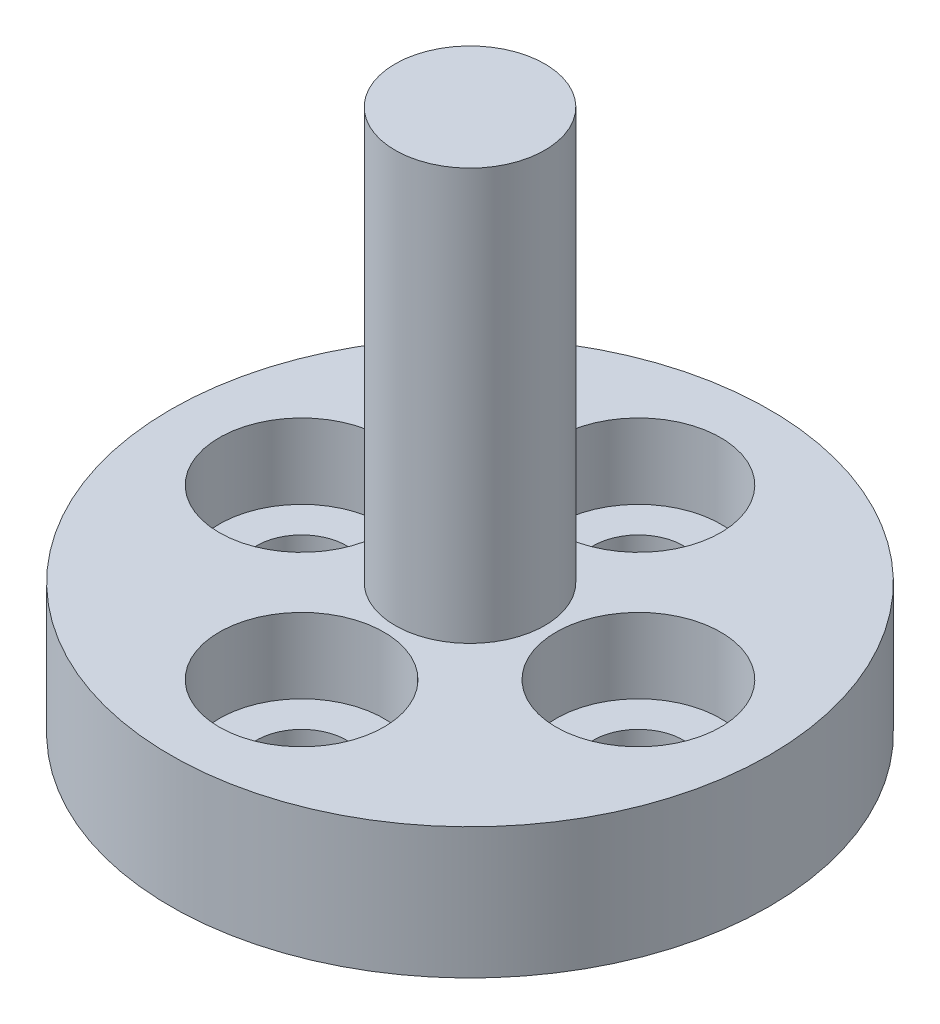
ISO-10303-21;
HEADER;
FILE_DESCRIPTION(('STEP AP214'),'2;1');
FILE_NAME('part.step','',(''),(''),'','','');
FILE_SCHEMA(('AUTOMOTIVE_DESIGN { 1 0 10303 214 1 1 1 1 }'));
ENDSEC;
DATA;
#1=APPLICATION_CONTEXT('core data for automotive mechanical design processes');
#2=APPLICATION_PROTOCOL_DEFINITION('international standard','automotive_design',2000,#1);
#3=PRODUCT_CONTEXT('',#1,'mechanical');
#4=PRODUCT('Part','Part','',(#3));
#5=PRODUCT_RELATED_PRODUCT_CATEGORY('part','',(#4));
#6=PRODUCT_DEFINITION_FORMATION('','',#4);
#7=PRODUCT_DEFINITION_CONTEXT('part definition',#1,'design');
#8=PRODUCT_DEFINITION('design','',#6,#7);
#9=PRODUCT_DEFINITION_SHAPE('','',#8);
#10=(LENGTH_UNIT() NAMED_UNIT(*) SI_UNIT(.MILLI.,.METRE.));
#11=(NAMED_UNIT(*) PLANE_ANGLE_UNIT() SI_UNIT($,.RADIAN.));
#12=(NAMED_UNIT(*) SI_UNIT($,.STERADIAN.) SOLID_ANGLE_UNIT());
#13=UNCERTAINTY_MEASURE_WITH_UNIT(LENGTH_MEASURE(1.E-05),#10,'distance_accuracy_value','');
#14=(GEOMETRIC_REPRESENTATION_CONTEXT(3) GLOBAL_UNCERTAINTY_ASSIGNED_CONTEXT((#13)) GLOBAL_UNIT_ASSIGNED_CONTEXT((#10,
#11,#12)) REPRESENTATION_CONTEXT('',''));
#15=CARTESIAN_POINT('',(0.,0.,0.));
#16=DIRECTION('',(0.,0.,1.));
#17=DIRECTION('',(1.,0.,0.));
#18=AXIS2_PLACEMENT_3D('',#15,#16,#17);
#19=CARTESIAN_POINT('',(0.,0.,0.));
#20=DIRECTION('',(0.,1.,0.));
#21=DIRECTION('',(-1.,0.,0.));
#22=AXIS2_PLACEMENT_3D('',#19,#20,#21);
#23=PLANE('',#22);
#24=CARTESIAN_POINT('',(-4.5,0.,0.));
#25=DIRECTION('',(0.,1.,0.));
#26=DIRECTION('',(0.,0.,1.));
#27=AXIS2_PLACEMENT_3D('',#24,#25,#26);
#28=CIRCLE('',#27,1.2);
#29=CARTESIAN_POINT('',(-4.5,0.,1.2));
#30=VERTEX_POINT('',#29);
#31=EDGE_CURVE('E108',#30,#30,#28,.T.);
#32=ORIENTED_EDGE('',*,*,#31,.T.);
#33=EDGE_LOOP('',(#32));
#34=FACE_BOUND('',#33,.T.);
#35=CARTESIAN_POINT('',(0.,0.,-4.5));
#36=DIRECTION('',(0.,1.,0.));
#37=DIRECTION('',(0.,0.,1.));
#38=AXIS2_PLACEMENT_3D('',#35,#36,#37);
#39=CIRCLE('',#38,1.2);
#40=CARTESIAN_POINT('',(0.,0.,-3.3));
#41=VERTEX_POINT('',#40);
#42=EDGE_CURVE('E92',#41,#41,#39,.T.);
#43=ORIENTED_EDGE('',*,*,#42,.T.);
#44=EDGE_LOOP('',(#43));
#45=FACE_BOUND('',#44,.T.);
#46=CARTESIAN_POINT('',(4.5,0.,0.));
#47=DIRECTION('',(0.,1.,0.));
#48=DIRECTION('',(0.,0.,1.));
#49=AXIS2_PLACEMENT_3D('',#46,#47,#48);
#50=CIRCLE('',#49,1.2);
#51=CARTESIAN_POINT('',(4.5,0.,1.2));
#52=VERTEX_POINT('',#51);
#53=EDGE_CURVE('E76',#52,#52,#50,.T.);
#54=ORIENTED_EDGE('',*,*,#53,.T.);
#55=EDGE_LOOP('',(#54));
#56=FACE_BOUND('',#55,.T.);
#57=CARTESIAN_POINT('',(0.,0.,4.5));
#58=DIRECTION('',(0.,1.,0.));
#59=DIRECTION('',(0.,0.,1.));
#60=AXIS2_PLACEMENT_3D('',#57,#58,#59);
#61=CIRCLE('',#60,1.2);
#62=CARTESIAN_POINT('',(0.,0.,5.7));
#63=VERTEX_POINT('',#62);
#64=EDGE_CURVE('E60',#63,#63,#61,.T.);
#65=ORIENTED_EDGE('',*,*,#64,.T.);
#66=EDGE_LOOP('',(#65));
#67=FACE_BOUND('',#66,.T.);
#68=CARTESIAN_POINT('',(0.,0.,0.));
#69=DIRECTION('',(0.,1.,0.));
#70=DIRECTION('',(-1.,0.,0.));
#71=AXIS2_PLACEMENT_3D('',#68,#69,#70);
#72=CIRCLE('',#71,8.);
#73=CARTESIAN_POINT('',(-8.,0.,0.));
#74=VERTEX_POINT('',#73);
#75=EDGE_CURVE('E10',#74,#74,#72,.T.);
#76=ORIENTED_EDGE('',*,*,#75,.F.);
#77=EDGE_LOOP('',(#76));
#78=FACE_BOUND('',#77,.T.);
#79=ADVANCED_FACE('F37',(#34,#45,#56,#67,#78),#23,.F.);
#80=CARTESIAN_POINT('',(0.,14.5,0.));
#81=DIRECTION('',(0.,1.,0.));
#82=DIRECTION('',(-1.,0.,0.));
#83=AXIS2_PLACEMENT_3D('',#80,#81,#82);
#84=CYLINDRICAL_SURFACE('',#83,8.);
#85=CARTESIAN_POINT('',(0.,3.5,0.));
#86=DIRECTION('',(0.,1.,0.));
#87=DIRECTION('',(-1.,0.,0.));
#88=AXIS2_PLACEMENT_3D('',#85,#86,#87);
#89=CIRCLE('',#88,8.);
#90=CARTESIAN_POINT('',(-8.,3.5,0.));
#91=VERTEX_POINT('',#90);
#92=EDGE_CURVE('E44',#91,#91,#89,.T.);
#93=ORIENTED_EDGE('',*,*,#92,.F.);
#94=EDGE_LOOP('',(#93));
#95=FACE_BOUND('',#94,.T.);
#96=ORIENTED_EDGE('',*,*,#75,.T.);
#97=EDGE_LOOP('',(#96));
#98=FACE_BOUND('',#97,.T.);
#99=ADVANCED_FACE('F131',(#95,#98),#84,.T.);
#100=CARTESIAN_POINT('',(8.,3.5,0.));
#101=DIRECTION('',(0.,-1.,0.));
#102=DIRECTION('',(1.,0.,0.));
#103=AXIS2_PLACEMENT_3D('',#100,#101,#102);
#104=PLANE('',#103);
#105=CARTESIAN_POINT('',(-4.5,3.5,0.));
#106=DIRECTION('',(0.,1.,0.));
#107=DIRECTION('',(0.,0.,1.));
#108=AXIS2_PLACEMENT_3D('',#105,#106,#107);
#109=CIRCLE('',#108,2.19999999999999);
#110=CARTESIAN_POINT('',(-4.5,3.5,2.19999999999999));
#111=VERTEX_POINT('',#110);
#112=EDGE_CURVE('E120',#111,#111,#109,.T.);
#113=ORIENTED_EDGE('',*,*,#112,.F.);
#114=EDGE_LOOP('',(#113));
#115=FACE_BOUND('',#114,.T.);
#116=CARTESIAN_POINT('',(0.,3.5,-4.5));
#117=DIRECTION('',(0.,1.,0.));
#118=DIRECTION('',(0.,0.,1.));
#119=AXIS2_PLACEMENT_3D('',#116,#117,#118);
#120=CIRCLE('',#119,2.19999999999999);
#121=CARTESIAN_POINT('',(0.,3.5,-2.30000000000001));
#122=VERTEX_POINT('',#121);
#123=EDGE_CURVE('E104',#122,#122,#120,.T.);
#124=ORIENTED_EDGE('',*,*,#123,.F.);
#125=EDGE_LOOP('',(#124));
#126=FACE_BOUND('',#125,.T.);
#127=CARTESIAN_POINT('',(4.5,3.5,0.));
#128=DIRECTION('',(0.,1.,0.));
#129=DIRECTION('',(0.,0.,1.));
#130=AXIS2_PLACEMENT_3D('',#127,#128,#129);
#131=CIRCLE('',#130,2.19999999999999);
#132=CARTESIAN_POINT('',(4.5,3.5,2.19999999999999));
#133=VERTEX_POINT('',#132);
#134=EDGE_CURVE('E88',#133,#133,#131,.T.);
#135=ORIENTED_EDGE('',*,*,#134,.F.);
#136=EDGE_LOOP('',(#135));
#137=FACE_BOUND('',#136,.T.);
#138=CARTESIAN_POINT('',(0.,3.5,4.5));
#139=DIRECTION('',(0.,1.,0.));
#140=DIRECTION('',(0.,0.,1.));
#141=AXIS2_PLACEMENT_3D('',#138,#139,#140);
#142=CIRCLE('',#141,2.19999999999999);
#143=CARTESIAN_POINT('',(0.,3.5,6.69999999999999));
#144=VERTEX_POINT('',#143);
#145=EDGE_CURVE('E72',#144,#144,#142,.T.);
#146=ORIENTED_EDGE('',*,*,#145,.F.);
#147=EDGE_LOOP('',(#146));
#148=FACE_BOUND('',#147,.T.);
#149=CARTESIAN_POINT('',(0.,3.5,0.));
#150=DIRECTION('',(0.,1.,0.));
#151=DIRECTION('',(-1.,0.,0.));
#152=AXIS2_PLACEMENT_3D('',#149,#150,#151);
#153=CIRCLE('',#152,2.);
#154=CARTESIAN_POINT('',(-2.,3.5,0.));
#155=VERTEX_POINT('',#154);
#156=EDGE_CURVE('E49',#155,#155,#153,.T.);
#157=ORIENTED_EDGE('',*,*,#156,.F.);
#158=EDGE_LOOP('',(#157));
#159=FACE_BOUND('',#158,.T.);
#160=ORIENTED_EDGE('',*,*,#92,.T.);
#161=EDGE_LOOP('',(#160));
#162=FACE_BOUND('',#161,.T.);
#163=ADVANCED_FACE('F127',(#115,#126,#137,#148,#159,#162),#104,.F.);
#164=CARTESIAN_POINT('',(0.,14.5,0.));
#165=DIRECTION('',(0.,1.,0.));
#166=DIRECTION('',(-1.,0.,0.));
#167=AXIS2_PLACEMENT_3D('',#164,#165,#166);
#168=CYLINDRICAL_SURFACE('',#167,2.);
#169=CARTESIAN_POINT('',(0.,14.5,0.));
#170=DIRECTION('',(0.,1.,0.));
#171=DIRECTION('',(-1.,0.,0.));
#172=AXIS2_PLACEMENT_3D('',#169,#170,#171);
#173=CIRCLE('',#172,2.);
#174=CARTESIAN_POINT('',(-2.,14.5,0.));
#175=VERTEX_POINT('',#174);
#176=EDGE_CURVE('E54',#175,#175,#173,.T.);
#177=ORIENTED_EDGE('',*,*,#176,.F.);
#178=EDGE_LOOP('',(#177));
#179=FACE_BOUND('',#178,.T.);
#180=ORIENTED_EDGE('',*,*,#156,.T.);
#181=EDGE_LOOP('',(#180));
#182=FACE_BOUND('',#181,.T.);
#183=ADVANCED_FACE('F130',(#179,#182),#168,.T.);
#184=CARTESIAN_POINT('',(2.,14.5,0.));
#185=DIRECTION('',(0.,-1.,0.));
#186=DIRECTION('',(1.,0.,0.));
#187=AXIS2_PLACEMENT_3D('',#184,#185,#186);
#188=PLANE('',#187);
#189=ORIENTED_EDGE('',*,*,#176,.T.);
#190=EDGE_LOOP('',(#189));
#191=FACE_BOUND('',#190,.T.);
#192=ADVANCED_FACE('F142',(#191),#188,.F.);
#193=CARTESIAN_POINT('',(0.,3.5,4.5));
#194=DIRECTION('',(0.,1.,0.));
#195=DIRECTION('',(0.,0.,1.));
#196=AXIS2_PLACEMENT_3D('',#193,#194,#195);
#197=CYLINDRICAL_SURFACE('',#196,1.2);
#198=ORIENTED_EDGE('',*,*,#64,.F.);
#199=EDGE_LOOP('',(#198));
#200=FACE_BOUND('',#199,.T.);
#201=CARTESIAN_POINT('',(0.,1.5,4.5));
#202=DIRECTION('',(0.,1.,0.));
#203=DIRECTION('',(0.,0.,1.));
#204=AXIS2_PLACEMENT_3D('',#201,#202,#203);
#205=CIRCLE('',#204,1.2);
#206=CARTESIAN_POINT('',(0.,1.5,5.7));
#207=VERTEX_POINT('',#206);
#208=EDGE_CURVE('E64',#207,#207,#205,.T.);
#209=ORIENTED_EDGE('',*,*,#208,.T.);
#210=EDGE_LOOP('',(#209));
#211=FACE_BOUND('',#210,.T.);
#212=ADVANCED_FACE('F148',(#200,#211),#197,.F.);
#213=CARTESIAN_POINT('',(1.2,1.5,4.5));
#214=DIRECTION('',(0.,-1.,0.));
#215=DIRECTION('',(0.,0.,-1.));
#216=AXIS2_PLACEMENT_3D('',#213,#214,#215);
#217=PLANE('',#216);
#218=ORIENTED_EDGE('',*,*,#208,.F.);
#219=EDGE_LOOP('',(#218));
#220=FACE_BOUND('',#219,.T.);
#221=CARTESIAN_POINT('',(0.,1.5,4.5));
#222=DIRECTION('',(0.,1.,0.));
#223=DIRECTION('',(0.,0.,1.));
#224=AXIS2_PLACEMENT_3D('',#221,#222,#223);
#225=CIRCLE('',#224,2.2);
#226=CARTESIAN_POINT('',(0.,1.5,6.7));
#227=VERTEX_POINT('',#226);
#228=EDGE_CURVE('E68',#227,#227,#225,.T.);
#229=ORIENTED_EDGE('',*,*,#228,.T.);
#230=EDGE_LOOP('',(#229));
#231=FACE_BOUND('',#230,.T.);
#232=ADVANCED_FACE('F169',(#220,#231),#217,.F.);
#233=CARTESIAN_POINT('',(0.,3.5,4.5));
#234=DIRECTION('',(0.,1.,0.));
#235=DIRECTION('',(0.,0.,1.));
#236=AXIS2_PLACEMENT_3D('',#233,#234,#235);
#237=CYLINDRICAL_SURFACE('',#236,2.19999999999999);
#238=ORIENTED_EDGE('',*,*,#228,.F.);
#239=EDGE_LOOP('',(#238));
#240=FACE_BOUND('',#239,.T.);
#241=ORIENTED_EDGE('',*,*,#145,.T.);
#242=EDGE_LOOP('',(#241));
#243=FACE_BOUND('',#242,.T.);
#244=ADVANCED_FACE('F175',(#240,#243),#237,.F.);
#245=CARTESIAN_POINT('',(4.5,3.5,0.));
#246=DIRECTION('',(0.,1.,0.));
#247=DIRECTION('',(0.,0.,1.));
#248=AXIS2_PLACEMENT_3D('',#245,#246,#247);
#249=CYLINDRICAL_SURFACE('',#248,1.2);
#250=ORIENTED_EDGE('',*,*,#53,.F.);
#251=EDGE_LOOP('',(#250));
#252=FACE_BOUND('',#251,.T.);
#253=CARTESIAN_POINT('',(4.5,1.5,0.));
#254=DIRECTION('',(0.,1.,0.));
#255=DIRECTION('',(0.,0.,1.));
#256=AXIS2_PLACEMENT_3D('',#253,#254,#255);
#257=CIRCLE('',#256,1.2);
#258=CARTESIAN_POINT('',(4.5,1.5,1.2));
#259=VERTEX_POINT('',#258);
#260=EDGE_CURVE('E80',#259,#259,#257,.T.);
#261=ORIENTED_EDGE('',*,*,#260,.T.);
#262=EDGE_LOOP('',(#261));
#263=FACE_BOUND('',#262,.T.);
#264=ADVANCED_FACE('F181',(#252,#263),#249,.F.);
#265=CARTESIAN_POINT('',(5.7,1.5,0.));
#266=DIRECTION('',(0.,-1.,0.));
#267=DIRECTION('',(0.,0.,-1.));
#268=AXIS2_PLACEMENT_3D('',#265,#266,#267);
#269=PLANE('',#268);
#270=ORIENTED_EDGE('',*,*,#260,.F.);
#271=EDGE_LOOP('',(#270));
#272=FACE_BOUND('',#271,.T.);
#273=CARTESIAN_POINT('',(4.5,1.5,0.));
#274=DIRECTION('',(0.,1.,0.));
#275=DIRECTION('',(0.,0.,1.));
#276=AXIS2_PLACEMENT_3D('',#273,#274,#275);
#277=CIRCLE('',#276,2.2);
#278=CARTESIAN_POINT('',(4.5,1.5,2.2));
#279=VERTEX_POINT('',#278);
#280=EDGE_CURVE('E84',#279,#279,#277,.T.);
#281=ORIENTED_EDGE('',*,*,#280,.T.);
#282=EDGE_LOOP('',(#281));
#283=FACE_BOUND('',#282,.T.);
#284=ADVANCED_FACE('F186',(#272,#283),#269,.F.);
#285=CARTESIAN_POINT('',(4.5,3.5,0.));
#286=DIRECTION('',(0.,1.,0.));
#287=DIRECTION('',(0.,0.,1.));
#288=AXIS2_PLACEMENT_3D('',#285,#286,#287);
#289=CYLINDRICAL_SURFACE('',#288,2.19999999999999);
#290=ORIENTED_EDGE('',*,*,#280,.F.);
#291=EDGE_LOOP('',(#290));
#292=FACE_BOUND('',#291,.T.);
#293=ORIENTED_EDGE('',*,*,#134,.T.);
#294=EDGE_LOOP('',(#293));
#295=FACE_BOUND('',#294,.T.);
#296=ADVANCED_FACE('F192',(#292,#295),#289,.F.);
#297=CARTESIAN_POINT('',(0.,3.5,-4.5));
#298=DIRECTION('',(0.,1.,0.));
#299=DIRECTION('',(0.,0.,1.));
#300=AXIS2_PLACEMENT_3D('',#297,#298,#299);
#301=CYLINDRICAL_SURFACE('',#300,1.2);
#302=ORIENTED_EDGE('',*,*,#42,.F.);
#303=EDGE_LOOP('',(#302));
#304=FACE_BOUND('',#303,.T.);
#305=CARTESIAN_POINT('',(0.,1.5,-4.5));
#306=DIRECTION('',(0.,1.,0.));
#307=DIRECTION('',(0.,0.,1.));
#308=AXIS2_PLACEMENT_3D('',#305,#306,#307);
#309=CIRCLE('',#308,1.2);
#310=CARTESIAN_POINT('',(0.,1.5,-3.3));
#311=VERTEX_POINT('',#310);
#312=EDGE_CURVE('E96',#311,#311,#309,.T.);
#313=ORIENTED_EDGE('',*,*,#312,.T.);
#314=EDGE_LOOP('',(#313));
#315=FACE_BOUND('',#314,.T.);
#316=ADVANCED_FACE('F196',(#304,#315),#301,.F.);
#317=CARTESIAN_POINT('',(1.2,1.5,-4.5));
#318=DIRECTION('',(0.,-1.,0.));
#319=DIRECTION('',(0.,0.,-1.));
#320=AXIS2_PLACEMENT_3D('',#317,#318,#319);
#321=PLANE('',#320);
#322=ORIENTED_EDGE('',*,*,#312,.F.);
#323=EDGE_LOOP('',(#322));
#324=FACE_BOUND('',#323,.T.);
#325=CARTESIAN_POINT('',(0.,1.5,-4.5));
#326=DIRECTION('',(0.,1.,0.));
#327=DIRECTION('',(0.,0.,1.));
#328=AXIS2_PLACEMENT_3D('',#325,#326,#327);
#329=CIRCLE('',#328,2.2);
#330=CARTESIAN_POINT('',(0.,1.5,-2.3));
#331=VERTEX_POINT('',#330);
#332=EDGE_CURVE('E100',#331,#331,#329,.T.);
#333=ORIENTED_EDGE('',*,*,#332,.T.);
#334=EDGE_LOOP('',(#333));
#335=FACE_BOUND('',#334,.T.);
#336=ADVANCED_FACE('F200',(#324,#335),#321,.F.);
#337=CARTESIAN_POINT('',(0.,3.5,-4.5));
#338=DIRECTION('',(0.,1.,0.));
#339=DIRECTION('',(0.,0.,1.));
#340=AXIS2_PLACEMENT_3D('',#337,#338,#339);
#341=CYLINDRICAL_SURFACE('',#340,2.19999999999999);
#342=ORIENTED_EDGE('',*,*,#332,.F.);
#343=EDGE_LOOP('',(#342));
#344=FACE_BOUND('',#343,.T.);
#345=ORIENTED_EDGE('',*,*,#123,.T.);
#346=EDGE_LOOP('',(#345));
#347=FACE_BOUND('',#346,.T.);
#348=ADVANCED_FACE('F204',(#344,#347),#341,.F.);
#349=CARTESIAN_POINT('',(-4.5,3.5,0.));
#350=DIRECTION('',(0.,1.,0.));
#351=DIRECTION('',(0.,0.,1.));
#352=AXIS2_PLACEMENT_3D('',#349,#350,#351);
#353=CYLINDRICAL_SURFACE('',#352,1.2);
#354=ORIENTED_EDGE('',*,*,#31,.F.);
#355=EDGE_LOOP('',(#354));
#356=FACE_BOUND('',#355,.T.);
#357=CARTESIAN_POINT('',(-4.5,1.5,0.));
#358=DIRECTION('',(0.,1.,0.));
#359=DIRECTION('',(0.,0.,1.));
#360=AXIS2_PLACEMENT_3D('',#357,#358,#359);
#361=CIRCLE('',#360,1.2);
#362=CARTESIAN_POINT('',(-4.5,1.5,1.2));
#363=VERTEX_POINT('',#362);
#364=EDGE_CURVE('E112',#363,#363,#361,.T.);
#365=ORIENTED_EDGE('',*,*,#364,.T.);
#366=EDGE_LOOP('',(#365));
#367=FACE_BOUND('',#366,.T.);
#368=ADVANCED_FACE('F208',(#356,#367),#353,.F.);
#369=CARTESIAN_POINT('',(-3.3,1.5,0.));
#370=DIRECTION('',(0.,-1.,0.));
#371=DIRECTION('',(0.,0.,-1.));
#372=AXIS2_PLACEMENT_3D('',#369,#370,#371);
#373=PLANE('',#372);
#374=ORIENTED_EDGE('',*,*,#364,.F.);
#375=EDGE_LOOP('',(#374));
#376=FACE_BOUND('',#375,.T.);
#377=CARTESIAN_POINT('',(-4.5,1.5,0.));
#378=DIRECTION('',(0.,1.,0.));
#379=DIRECTION('',(0.,0.,1.));
#380=AXIS2_PLACEMENT_3D('',#377,#378,#379);
#381=CIRCLE('',#380,2.2);
#382=CARTESIAN_POINT('',(-4.5,1.5,2.2));
#383=VERTEX_POINT('',#382);
#384=EDGE_CURVE('E116',#383,#383,#381,.T.);
#385=ORIENTED_EDGE('',*,*,#384,.T.);
#386=EDGE_LOOP('',(#385));
#387=FACE_BOUND('',#386,.T.);
#388=ADVANCED_FACE('F212',(#376,#387),#373,.F.);
#389=CARTESIAN_POINT('',(-4.5,3.5,0.));
#390=DIRECTION('',(0.,1.,0.));
#391=DIRECTION('',(0.,0.,1.));
#392=AXIS2_PLACEMENT_3D('',#389,#390,#391);
#393=CYLINDRICAL_SURFACE('',#392,2.19999999999999);
#394=ORIENTED_EDGE('',*,*,#384,.F.);
#395=EDGE_LOOP('',(#394));
#396=FACE_BOUND('',#395,.T.);
#397=ORIENTED_EDGE('',*,*,#112,.T.);
#398=EDGE_LOOP('',(#397));
#399=FACE_BOUND('',#398,.T.);
#400=ADVANCED_FACE('F125',(#396,#399),#393,.F.);
#401=CLOSED_SHELL('',(#79,#99,#163,#183,#192,#212,#232,#244,#264,#284,#296,#316,#336,#348,#368,
#388,#400));
#402=MANIFOLD_SOLID_BREP('B2',#401);
#403=ADVANCED_BREP_SHAPE_REPRESENTATION('',(#18,#402),#14);
#404=SHAPE_DEFINITION_REPRESENTATION(#9,#403);
ENDSEC;
END-ISO-10303-21;
